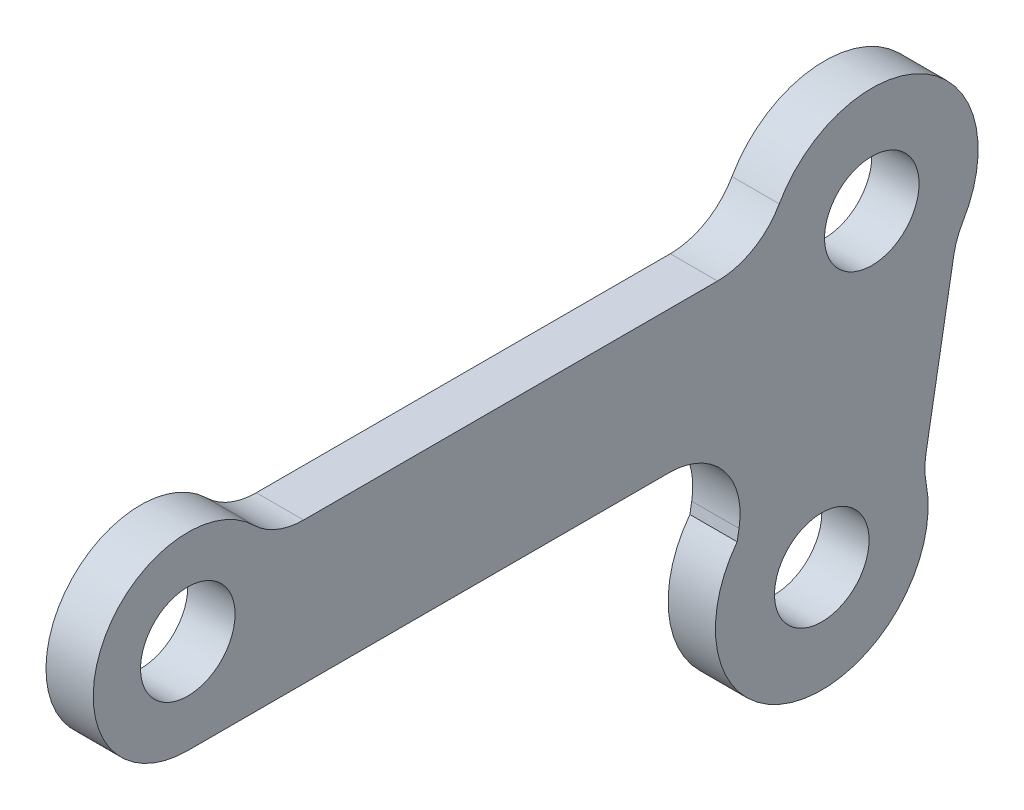
ISO-10303-21;
HEADER;
FILE_DESCRIPTION(('STEP AP214'),'2;1');
FILE_NAME('part.step','',(''),(''),'','','');
FILE_SCHEMA(('AUTOMOTIVE_DESIGN { 1 0 10303 214 1 1 1 1 }'));
ENDSEC;
DATA;
#1=APPLICATION_CONTEXT('core data for automotive mechanical design processes');
#2=APPLICATION_PROTOCOL_DEFINITION('international standard','automotive_design',2000,#1);
#3=PRODUCT_CONTEXT('',#1,'mechanical');
#4=PRODUCT('Part','Part','',(#3));
#5=PRODUCT_RELATED_PRODUCT_CATEGORY('part','',(#4));
#6=PRODUCT_DEFINITION_FORMATION('','',#4);
#7=PRODUCT_DEFINITION_CONTEXT('part definition',#1,'design');
#8=PRODUCT_DEFINITION('design','',#6,#7);
#9=PRODUCT_DEFINITION_SHAPE('','',#8);
#10=(LENGTH_UNIT() NAMED_UNIT(*) SI_UNIT(.MILLI.,.METRE.));
#11=(NAMED_UNIT(*) PLANE_ANGLE_UNIT() SI_UNIT($,.RADIAN.));
#12=(NAMED_UNIT(*) SI_UNIT($,.STERADIAN.) SOLID_ANGLE_UNIT());
#13=UNCERTAINTY_MEASURE_WITH_UNIT(LENGTH_MEASURE(1.E-05),#10,'distance_accuracy_value','');
#14=(GEOMETRIC_REPRESENTATION_CONTEXT(3) GLOBAL_UNCERTAINTY_ASSIGNED_CONTEXT((#13)) GLOBAL_UNIT_ASSIGNED_CONTEXT((#10,
#11,#12)) REPRESENTATION_CONTEXT('',''));
#15=CARTESIAN_POINT('',(0.,0.,0.));
#16=DIRECTION('',(0.,0.,1.));
#17=DIRECTION('',(1.,0.,0.));
#18=AXIS2_PLACEMENT_3D('',#15,#16,#17);
#19=CARTESIAN_POINT('',(0.,-2.,25.));
#20=DIRECTION('',(1.,0.,0.));
#21=DIRECTION('',(0.,0.,-1.));
#22=AXIS2_PLACEMENT_3D('',#19,#20,#21);
#23=PLANE('',#22);
#24=CARTESIAN_POINT('',(0.,-2.,25.));
#25=DIRECTION('',(1.,0.,0.));
#26=DIRECTION('',(0.,0.,-1.));
#27=AXIS2_PLACEMENT_3D('',#24,#25,#26);
#28=CIRCLE('',#27,2.);
#29=CARTESIAN_POINT('',(0.,-2.,23.));
#30=VERTEX_POINT('',#29);
#31=EDGE_CURVE('E438',#30,#30,#28,.T.);
#32=ORIENTED_EDGE('',*,*,#31,.T.);
#33=EDGE_LOOP('',(#32));
#34=FACE_BOUND('',#33,.T.);
#35=CARTESIAN_POINT('',(0.,-0.694592710667744,-3.93923101204885));
#36=DIRECTION('',(1.,0.,0.));
#37=DIRECTION('',(0.,0.,-1.));
#38=AXIS2_PLACEMENT_3D('',#35,#36,#37);
#39=CIRCLE('',#38,2.);
#40=CARTESIAN_POINT('',(0.,-0.694592710667744,-5.93923101204885));
#41=VERTEX_POINT('',#40);
#42=EDGE_CURVE('E434',#41,#41,#39,.T.);
#43=ORIENTED_EDGE('',*,*,#42,.T.);
#44=EDGE_LOOP('',(#43));
#45=FACE_BOUND('',#44,.T.);
#46=CARTESIAN_POINT('',(0.,-12.6945927106677,-1.82330724354715));
#47=DIRECTION('',(1.,0.,0.));
#48=DIRECTION('',(0.,0.,-1.));
#49=AXIS2_PLACEMENT_3D('',#46,#47,#48);
#50=CIRCLE('',#49,2.);
#51=CARTESIAN_POINT('',(0.,-12.6945927106677,-3.82330724354715));
#52=VERTEX_POINT('',#51);
#53=EDGE_CURVE('E426',#52,#52,#50,.T.);
#54=ORIENTED_EDGE('',*,*,#53,.T.);
#55=EDGE_LOOP('',(#54));
#56=FACE_BOUND('',#55,.T.);
#57=CARTESIAN_POINT('',(0.,-0.694592710667744,-3.93923101204885));
#58=DIRECTION('',(1.,0.,0.));
#59=DIRECTION('',(0.,0.,-1.));
#60=AXIS2_PLACEMENT_3D('',#57,#58,#59);
#61=CIRCLE('',#60,4.50000000000002);
#62=CARTESIAN_POINT('',(0.,-3.01492067286327,-7.79488635814162));
#63=VERTEX_POINT('',#62);
#64=CARTESIAN_POINT('',(0.,1.52216291573291,-0.0231111858916789));
#65=VERTEX_POINT('',#64);
#66=EDGE_CURVE('E246',#63,#65,#61,.T.);
#67=ORIENTED_EDGE('',*,*,#66,.F.);
#68=CARTESIAN_POINT('',(0.,-4.56180598099362,-10.3653232555368));
#69=DIRECTION('',(1.,0.,0.));
#70=DIRECTION('',(0.,0.,-1.));
#71=AXIS2_PLACEMENT_3D('',#68,#69,#70);
#72=CIRCLE('',#71,3.);
#73=CARTESIAN_POINT('',(0.,-4.0408614479928,-7.41089999650016));
#74=VERTEX_POINT('',#73);
#75=EDGE_CURVE('E319',#63,#74,#72,.T.);
#76=ORIENTED_EDGE('',*,*,#75,.T.);
#77=DIRECTION('',(0.,-0.984807753012206,0.173648177666942));
#78=VECTOR('',#77,1.);
#79=CARTESIAN_POINT('',(0.,-1.38918542133549,-7.8784620240977));
#80=LINE('',#79,#78);
#81=CARTESIAN_POINT('',(0.,-10.7375093946782,-6.23010028319352));
#82=VERTEX_POINT('',#81);
#83=EDGE_CURVE('E259',#74,#82,#80,.T.);
#84=ORIENTED_EDGE('',*,*,#83,.T.);
#85=CARTESIAN_POINT('',(0.,-11.258453927679,-9.18452354223013));
#86=DIRECTION('',(1.,0.,0.));
#87=DIRECTION('',(0.,0.,-1.));
#88=AXIS2_PLACEMENT_3D('',#85,#86,#87);
#89=CIRCLE('',#88,3.);
#90=CARTESIAN_POINT('',(0.,-11.8329094408745,-6.24003702275695));
#91=VERTEX_POINT('',#90);
#92=EDGE_CURVE('E313',#82,#91,#89,.T.);
#93=ORIENTED_EDGE('',*,*,#92,.T.);
#94=CARTESIAN_POINT('',(0.,-12.6945927106677,-1.82330724354715));
#95=DIRECTION('',(1.,0.,0.));
#96=DIRECTION('',(0.,0.,-1.));
#97=AXIS2_PLACEMENT_3D('',#94,#95,#96);
#98=CIRCLE('',#97,4.50000000000002);
#99=CARTESIAN_POINT('',(0.,-9.96976680670167,1.75793887939326));
#100=VERTEX_POINT('',#99);
#101=EDGE_CURVE('E273',#100,#91,#98,.T.);
#102=ORIENTED_EDGE('',*,*,#101,.F.);
#103=DIRECTION('',(0.,-0.984807753012207,0.173648177666938));
#104=VECTOR('',#103,1.);
#105=CARTESIAN_POINT('',(0.,0.,0.));
#106=LINE('',#105,#104);
#107=CARTESIAN_POINT('',(0.,-9.52094453300082,1.67879940299688));
#108=VERTEX_POINT('',#107);
#109=EDGE_CURVE('E263',#108,#100,#106,.T.);
#110=ORIENTED_EDGE('',*,*,#109,.F.);
#111=CARTESIAN_POINT('',(0.,-9.00000000000001,4.6332226620335));
#112=DIRECTION('',(1.,0.,0.));
#113=DIRECTION('',(0.,0.,-1.));
#114=AXIS2_PLACEMENT_3D('',#111,#112,#113);
#115=CIRCLE('',#114,3.);
#116=CARTESIAN_POINT('',(0.,-6.,4.6332226620335));
#117=VERTEX_POINT('',#116);
#118=EDGE_CURVE('E236',#108,#117,#115,.T.);
#119=ORIENTED_EDGE('',*,*,#118,.T.);
#120=DIRECTION('',(0.,0.,-1.));
#121=VECTOR('',#120,1.);
#122=CARTESIAN_POINT('',(0.,-6.,25.));
#123=LINE('',#122,#121);
#124=CARTESIAN_POINT('',(0.,-5.99999999999999,25.));
#125=VERTEX_POINT('',#124);
#126=EDGE_CURVE('E227',#125,#117,#123,.T.);
#127=ORIENTED_EDGE('',*,*,#126,.F.);
#128=CARTESIAN_POINT('',(0.,-2.,25.));
#129=DIRECTION('',(1.,0.,0.));
#130=DIRECTION('',(0.,0.,-1.));
#131=AXIS2_PLACEMENT_3D('',#128,#129,#130);
#132=CIRCLE('',#131,3.99999999999999);
#133=CARTESIAN_POINT('',(0.,0.857142857142855,22.200583151105));
#134=VERTEX_POINT('',#133);
#135=EDGE_CURVE('E212',#134,#125,#132,.T.);
#136=ORIENTED_EDGE('',*,*,#135,.F.);
#137=CARTESIAN_POINT('',(0.,3.,20.1010205144337));
#138=DIRECTION('',(1.,0.,0.));
#139=DIRECTION('',(0.,0.,-1.));
#140=AXIS2_PLACEMENT_3D('',#137,#138,#139);
#141=CIRCLE('',#140,3.);
#142=CARTESIAN_POINT('',(0.,0.,20.1010205144337));
#143=VERTEX_POINT('',#142);
#144=EDGE_CURVE('E132',#134,#143,#141,.T.);
#145=ORIENTED_EDGE('',*,*,#144,.T.);
#146=DIRECTION('',(0.,0.,-1.));
#147=VECTOR('',#146,1.);
#148=CARTESIAN_POINT('',(0.,0.,25.));
#149=LINE('',#148,#147);
#150=CARTESIAN_POINT('',(0.,0.,2.58763536487976));
#151=VERTEX_POINT('',#150);
#152=EDGE_CURVE('E238',#143,#151,#149,.T.);
#153=ORIENTED_EDGE('',*,*,#152,.T.);
#154=CARTESIAN_POINT('',(0.,3.,2.58763536487975));
#155=DIRECTION('',(1.,0.,0.));
#156=DIRECTION('',(0.,0.,-1.));
#157=AXIS2_PLACEMENT_3D('',#154,#155,#156);
#158=CIRCLE('',#157,3.);
#159=EDGE_CURVE('E330',#151,#65,#158,.T.);
#160=ORIENTED_EDGE('',*,*,#159,.T.);
#161=EDGE_LOOP('',(#67,#76,#84,#93,#102,#110,#119,#127,#136,#145,#153,#160));
#162=FACE_BOUND('',#161,.T.);
#163=ADVANCED_FACE('F123',(#34,#45,#56,#162),#23,.F.);
#164=CARTESIAN_POINT('',(2.,-2.,25.));
#165=DIRECTION('',(1.,0.,0.));
#166=DIRECTION('',(0.,0.,-1.));
#167=AXIS2_PLACEMENT_3D('',#164,#165,#166);
#168=PLANE('',#167);
#169=CARTESIAN_POINT('',(2.,-2.,25.));
#170=DIRECTION('',(1.,0.,0.));
#171=DIRECTION('',(0.,0.,-1.));
#172=AXIS2_PLACEMENT_3D('',#169,#170,#171);
#173=CIRCLE('',#172,2.);
#174=CARTESIAN_POINT('',(2.,-2.,23.));
#175=VERTEX_POINT('',#174);
#176=EDGE_CURVE('E277',#175,#175,#173,.T.);
#177=ORIENTED_EDGE('',*,*,#176,.F.);
#178=EDGE_LOOP('',(#177));
#179=FACE_BOUND('',#178,.T.);
#180=CARTESIAN_POINT('',(2.,-0.694592710667744,-3.93923101204885));
#181=DIRECTION('',(1.,0.,0.));
#182=DIRECTION('',(0.,0.,-1.));
#183=AXIS2_PLACEMENT_3D('',#180,#181,#182);
#184=CIRCLE('',#183,2.);
#185=CARTESIAN_POINT('',(2.,-0.694592710667744,-5.93923101204885));
#186=VERTEX_POINT('',#185);
#187=EDGE_CURVE('E430',#186,#186,#184,.T.);
#188=ORIENTED_EDGE('',*,*,#187,.F.);
#189=EDGE_LOOP('',(#188));
#190=FACE_BOUND('',#189,.T.);
#191=CARTESIAN_POINT('',(2.,-12.6945927106677,-1.82330724354715));
#192=DIRECTION('',(1.,0.,0.));
#193=DIRECTION('',(0.,0.,-1.));
#194=AXIS2_PLACEMENT_3D('',#191,#192,#193);
#195=CIRCLE('',#194,2.);
#196=CARTESIAN_POINT('',(2.,-12.6945927106677,-3.82330724354715));
#197=VERTEX_POINT('',#196);
#198=EDGE_CURVE('E422',#197,#197,#195,.T.);
#199=ORIENTED_EDGE('',*,*,#198,.F.);
#200=EDGE_LOOP('',(#199));
#201=FACE_BOUND('',#200,.T.);
#202=DIRECTION('',(0.,-0.984807753012206,0.173648177666942));
#203=VECTOR('',#202,1.);
#204=CARTESIAN_POINT('',(2.,-1.38918542133549,-7.8784620240977));
#205=LINE('',#204,#203);
#206=CARTESIAN_POINT('',(2.,-4.0408614479928,-7.41089999650016));
#207=VERTEX_POINT('',#206);
#208=CARTESIAN_POINT('',(2.,-10.7375093946782,-6.23010028319352));
#209=VERTEX_POINT('',#208);
#210=EDGE_CURVE('E258',#207,#209,#205,.T.);
#211=ORIENTED_EDGE('',*,*,#210,.F.);
#212=CARTESIAN_POINT('',(2.,-4.56180598099362,-10.3653232555368));
#213=DIRECTION('',(1.,0.,0.));
#214=DIRECTION('',(0.,0.,-1.));
#215=AXIS2_PLACEMENT_3D('',#212,#213,#214);
#216=CIRCLE('',#215,3.);
#217=CARTESIAN_POINT('',(2.,-3.01492067286327,-7.79488635814162));
#218=VERTEX_POINT('',#217);
#219=EDGE_CURVE('E322',#207,#218,#216,.F.);
#220=ORIENTED_EDGE('',*,*,#219,.T.);
#221=CARTESIAN_POINT('',(2.,-0.694592710667744,-3.93923101204885));
#222=DIRECTION('',(1.,0.,0.));
#223=DIRECTION('',(0.,0.,-1.));
#224=AXIS2_PLACEMENT_3D('',#221,#222,#223);
#225=CIRCLE('',#224,4.50000000000002);
#226=CARTESIAN_POINT('',(2.,1.52216291573291,-0.0231111858916789));
#227=VERTEX_POINT('',#226);
#228=EDGE_CURVE('E239',#218,#227,#225,.T.);
#229=ORIENTED_EDGE('',*,*,#228,.T.);
#230=CARTESIAN_POINT('',(2.,3.,2.58763536487975));
#231=DIRECTION('',(1.,0.,0.));
#232=DIRECTION('',(0.,0.,-1.));
#233=AXIS2_PLACEMENT_3D('',#230,#231,#232);
#234=CIRCLE('',#233,3.);
#235=CARTESIAN_POINT('',(2.,0.,2.58763536487976));
#236=VERTEX_POINT('',#235);
#237=EDGE_CURVE('E333',#227,#236,#234,.F.);
#238=ORIENTED_EDGE('',*,*,#237,.T.);
#239=DIRECTION('',(0.,0.,-1.));
#240=VECTOR('',#239,1.);
#241=CARTESIAN_POINT('',(2.,0.,25.));
#242=LINE('',#241,#240);
#243=CARTESIAN_POINT('',(2.,0.,20.1010205144337));
#244=VERTEX_POINT('',#243);
#245=EDGE_CURVE('E222',#244,#236,#242,.T.);
#246=ORIENTED_EDGE('',*,*,#245,.F.);
#247=CARTESIAN_POINT('',(2.,3.,20.1010205144337));
#248=DIRECTION('',(1.,0.,0.));
#249=DIRECTION('',(0.,0.,-1.));
#250=AXIS2_PLACEMENT_3D('',#247,#248,#249);
#251=CIRCLE('',#250,3.);
#252=CARTESIAN_POINT('',(2.,0.857142857142855,22.200583151105));
#253=VERTEX_POINT('',#252);
#254=EDGE_CURVE('E12',#244,#253,#251,.F.);
#255=ORIENTED_EDGE('',*,*,#254,.T.);
#256=CARTESIAN_POINT('',(2.,-2.,25.));
#257=DIRECTION('',(1.,0.,0.));
#258=DIRECTION('',(0.,0.,-1.));
#259=AXIS2_PLACEMENT_3D('',#256,#257,#258);
#260=CIRCLE('',#259,3.99999999999999);
#261=CARTESIAN_POINT('',(2.,-6.,25.));
#262=VERTEX_POINT('',#261);
#263=EDGE_CURVE('E221',#253,#262,#260,.T.);
#264=ORIENTED_EDGE('',*,*,#263,.T.);
#265=DIRECTION('',(0.,0.,-1.));
#266=VECTOR('',#265,1.);
#267=CARTESIAN_POINT('',(2.,-6.,25.));
#268=LINE('',#267,#266);
#269=CARTESIAN_POINT('',(2.,-6.,4.6332226620335));
#270=VERTEX_POINT('',#269);
#271=EDGE_CURVE('E230',#262,#270,#268,.T.);
#272=ORIENTED_EDGE('',*,*,#271,.T.);
#273=CARTESIAN_POINT('',(2.,-9.00000000000001,4.6332226620335));
#274=DIRECTION('',(1.,0.,0.));
#275=DIRECTION('',(0.,0.,-1.));
#276=AXIS2_PLACEMENT_3D('',#273,#274,#275);
#277=CIRCLE('',#276,3.);
#278=CARTESIAN_POINT('',(2.,-9.52094453300082,1.67879940299688));
#279=VERTEX_POINT('',#278);
#280=EDGE_CURVE('E327',#270,#279,#277,.F.);
#281=ORIENTED_EDGE('',*,*,#280,.T.);
#282=DIRECTION('',(0.,-0.984807753012207,0.173648177666938));
#283=VECTOR('',#282,1.);
#284=CARTESIAN_POINT('',(2.,0.,0.));
#285=LINE('',#284,#283);
#286=CARTESIAN_POINT('',(2.,-9.96976680670167,1.75793887939326));
#287=VERTEX_POINT('',#286);
#288=EDGE_CURVE('E255',#279,#287,#285,.T.);
#289=ORIENTED_EDGE('',*,*,#288,.T.);
#290=CARTESIAN_POINT('',(2.,-12.6945927106677,-1.82330724354715));
#291=DIRECTION('',(1.,0.,0.));
#292=DIRECTION('',(0.,0.,-1.));
#293=AXIS2_PLACEMENT_3D('',#290,#291,#292);
#294=CIRCLE('',#293,4.50000000000002);
#295=CARTESIAN_POINT('',(2.,-11.8329094408745,-6.24003702275695));
#296=VERTEX_POINT('',#295);
#297=EDGE_CURVE('E266',#287,#296,#294,.T.);
#298=ORIENTED_EDGE('',*,*,#297,.T.);
#299=CARTESIAN_POINT('',(2.,-11.258453927679,-9.18452354223013));
#300=DIRECTION('',(1.,0.,0.));
#301=DIRECTION('',(0.,0.,-1.));
#302=AXIS2_PLACEMENT_3D('',#299,#300,#301);
#303=CIRCLE('',#302,3.);
#304=EDGE_CURVE('E316',#296,#209,#303,.F.);
#305=ORIENTED_EDGE('',*,*,#304,.T.);
#306=EDGE_LOOP('',(#211,#220,#229,#238,#246,#255,#264,#272,#281,#289,#298,#305));
#307=FACE_BOUND('',#306,.T.);
#308=ADVANCED_FACE('F350',(#179,#190,#201,#307),#168,.T.);
#309=CARTESIAN_POINT('',(2.,-2.,25.));
#310=DIRECTION('',(-1.,0.,0.));
#311=DIRECTION('',(0.,0.,1.));
#312=AXIS2_PLACEMENT_3D('',#309,#310,#311);
#313=CYLINDRICAL_SURFACE('',#312,3.99999999999999);
#314=ORIENTED_EDGE('',*,*,#263,.F.);
#315=DIRECTION('',(-1.,0.,0.));
#316=VECTOR('',#315,1.);
#317=CARTESIAN_POINT('',(2.,0.857142857142856,22.200583151105));
#318=LINE('',#317,#316);
#319=EDGE_CURVE('E217',#253,#134,#318,.T.);
#320=ORIENTED_EDGE('',*,*,#319,.T.);
#321=ORIENTED_EDGE('',*,*,#135,.T.);
#322=DIRECTION('',(-1.,0.,0.));
#323=VECTOR('',#322,1.);
#324=CARTESIAN_POINT('',(2.,-6.,25.));
#325=LINE('',#324,#323);
#326=EDGE_CURVE('E215',#262,#125,#325,.T.);
#327=ORIENTED_EDGE('',*,*,#326,.F.);
#328=EDGE_LOOP('',(#314,#320,#321,#327));
#329=FACE_BOUND('',#328,.T.);
#330=ADVANCED_FACE('F214',(#329),#313,.T.);
#331=CARTESIAN_POINT('',(2.,-12.6945927106677,-1.82330724354715));
#332=DIRECTION('',(-1.,0.,0.));
#333=DIRECTION('',(0.,0.,1.));
#334=AXIS2_PLACEMENT_3D('',#331,#332,#333);
#335=CYLINDRICAL_SURFACE('',#334,4.50000000000002);
#336=ORIENTED_EDGE('',*,*,#101,.T.);
#337=DIRECTION('',(-1.,0.,0.));
#338=VECTOR('',#337,1.);
#339=CARTESIAN_POINT('',(2.,-11.8329094408745,-6.24003702275695));
#340=LINE('',#339,#338);
#341=EDGE_CURVE('E287',#91,#296,#340,.F.);
#342=ORIENTED_EDGE('',*,*,#341,.T.);
#343=ORIENTED_EDGE('',*,*,#297,.F.);
#344=DIRECTION('',(-1.,0.,0.));
#345=VECTOR('',#344,1.);
#346=CARTESIAN_POINT('',(2.,-9.96976680670167,1.75793887939326));
#347=LINE('',#346,#345);
#348=EDGE_CURVE('E254',#287,#100,#347,.T.);
#349=ORIENTED_EDGE('',*,*,#348,.T.);
#350=EDGE_LOOP('',(#336,#342,#343,#349));
#351=FACE_BOUND('',#350,.T.);
#352=ADVANCED_FACE('F349',(#351),#335,.T.);
#353=CARTESIAN_POINT('',(2.,-1.38918542133549,-7.8784620240977));
#354=DIRECTION('',(0.,-0.173648177666942,-0.984807753012206));
#355=DIRECTION('',(0.,0.984807753012206,-0.173648177666942));
#356=AXIS2_PLACEMENT_3D('',#353,#354,#355);
#357=PLANE('',#356);
#358=ORIENTED_EDGE('',*,*,#210,.T.);
#359=DIRECTION('',(-1.,0.,0.));
#360=VECTOR('',#359,1.);
#361=CARTESIAN_POINT('',(2.,-10.7375093946782,-6.23010028319352));
#362=LINE('',#361,#360);
#363=EDGE_CURVE('E283',#209,#82,#362,.T.);
#364=ORIENTED_EDGE('',*,*,#363,.T.);
#365=ORIENTED_EDGE('',*,*,#83,.F.);
#366=DIRECTION('',(-1.,0.,0.));
#367=VECTOR('',#366,1.);
#368=CARTESIAN_POINT('',(2.,-4.0408614479928,-7.41089999650016));
#369=LINE('',#368,#367);
#370=EDGE_CURVE('E232',#74,#207,#369,.F.);
#371=ORIENTED_EDGE('',*,*,#370,.T.);
#372=EDGE_LOOP('',(#358,#364,#365,#371));
#373=FACE_BOUND('',#372,.T.);
#374=ADVANCED_FACE('F356',(#373),#357,.T.);
#375=CARTESIAN_POINT('',(2.,0.,0.));
#376=DIRECTION('',(0.,-0.173648177666938,-0.984807753012207));
#377=DIRECTION('',(0.,0.984807753012207,-0.173648177666938));
#378=AXIS2_PLACEMENT_3D('',#375,#376,#377);
#379=PLANE('',#378);
#380=ORIENTED_EDGE('',*,*,#288,.F.);
#381=DIRECTION('',(-1.,0.,0.));
#382=VECTOR('',#381,1.);
#383=CARTESIAN_POINT('',(0.,-9.52094453300082,1.67879940299688));
#384=LINE('',#383,#382);
#385=EDGE_CURVE('E297',#279,#108,#384,.T.);
#386=ORIENTED_EDGE('',*,*,#385,.T.);
#387=ORIENTED_EDGE('',*,*,#109,.T.);
#388=ORIENTED_EDGE('',*,*,#348,.F.);
#389=EDGE_LOOP('',(#380,#386,#387,#388));
#390=FACE_BOUND('',#389,.T.);
#391=ADVANCED_FACE('F359',(#390),#379,.F.);
#392=CARTESIAN_POINT('',(2.,-0.694592710667744,-3.93923101204885));
#393=DIRECTION('',(-1.,0.,0.));
#394=DIRECTION('',(0.,0.,1.));
#395=AXIS2_PLACEMENT_3D('',#392,#393,#394);
#396=CYLINDRICAL_SURFACE('',#395,4.50000000000002);
#397=ORIENTED_EDGE('',*,*,#228,.F.);
#398=DIRECTION('',(-1.,0.,0.));
#399=VECTOR('',#398,1.);
#400=CARTESIAN_POINT('',(2.,-3.01492067286327,-7.79488635814162));
#401=LINE('',#400,#399);
#402=EDGE_CURVE('E293',#218,#63,#401,.T.);
#403=ORIENTED_EDGE('',*,*,#402,.T.);
#404=ORIENTED_EDGE('',*,*,#66,.T.);
#405=DIRECTION('',(-1.,0.,0.));
#406=VECTOR('',#405,1.);
#407=CARTESIAN_POINT('',(2.,1.52216291573291,-0.0231111858916789));
#408=LINE('',#407,#406);
#409=EDGE_CURVE('E290',#65,#227,#408,.F.);
#410=ORIENTED_EDGE('',*,*,#409,.T.);
#411=EDGE_LOOP('',(#397,#403,#404,#410));
#412=FACE_BOUND('',#411,.T.);
#413=ADVANCED_FACE('F363',(#412),#396,.T.);
#414=CARTESIAN_POINT('',(2.,0.,25.));
#415=DIRECTION('',(0.,1.,0.));
#416=DIRECTION('',(0.,0.,1.));
#417=AXIS2_PLACEMENT_3D('',#414,#415,#416);
#418=PLANE('',#417);
#419=ORIENTED_EDGE('',*,*,#245,.T.);
#420=DIRECTION('',(-1.,0.,0.));
#421=VECTOR('',#420,1.);
#422=CARTESIAN_POINT('',(2.,0.,2.58763536487976));
#423=LINE('',#422,#421);
#424=EDGE_CURVE('E307',#236,#151,#423,.T.);
#425=ORIENTED_EDGE('',*,*,#424,.T.);
#426=ORIENTED_EDGE('',*,*,#152,.F.);
#427=DIRECTION('',(-1.,0.,0.));
#428=VECTOR('',#427,1.);
#429=CARTESIAN_POINT('',(2.,0.,20.1010205144337));
#430=LINE('',#429,#428);
#431=EDGE_CURVE('E304',#143,#244,#430,.F.);
#432=ORIENTED_EDGE('',*,*,#431,.T.);
#433=EDGE_LOOP('',(#419,#425,#426,#432));
#434=FACE_BOUND('',#433,.T.);
#435=ADVANCED_FACE('F339',(#434),#418,.T.);
#436=CARTESIAN_POINT('',(2.,-6.,25.));
#437=DIRECTION('',(0.,1.,0.));
#438=DIRECTION('',(0.,0.,1.));
#439=AXIS2_PLACEMENT_3D('',#436,#437,#438);
#440=PLANE('',#439);
#441=ORIENTED_EDGE('',*,*,#126,.T.);
#442=DIRECTION('',(-1.,0.,0.));
#443=VECTOR('',#442,1.);
#444=CARTESIAN_POINT('',(2.,-6.,4.6332226620335));
#445=LINE('',#444,#443);
#446=EDGE_CURVE('E301',#117,#270,#445,.F.);
#447=ORIENTED_EDGE('',*,*,#446,.T.);
#448=ORIENTED_EDGE('',*,*,#271,.F.);
#449=ORIENTED_EDGE('',*,*,#326,.T.);
#450=EDGE_LOOP('',(#441,#447,#448,#449));
#451=FACE_BOUND('',#450,.T.);
#452=ADVANCED_FACE('F226',(#451),#440,.F.);
#453=CARTESIAN_POINT('',(2.,-12.6945927106677,-1.82330724354715));
#454=DIRECTION('',(-1.,0.,0.));
#455=DIRECTION('',(0.,0.,1.));
#456=AXIS2_PLACEMENT_3D('',#453,#454,#455);
#457=CYLINDRICAL_SURFACE('',#456,2.);
#458=ORIENTED_EDGE('',*,*,#198,.T.);
#459=EDGE_LOOP('',(#458));
#460=FACE_BOUND('',#459,.T.);
#461=ORIENTED_EDGE('',*,*,#53,.F.);
#462=EDGE_LOOP('',(#461));
#463=FACE_BOUND('',#462,.T.);
#464=ADVANCED_FACE('F362',(#460,#463),#457,.F.);
#465=CARTESIAN_POINT('',(2.,-0.694592710667744,-3.93923101204885));
#466=DIRECTION('',(-1.,0.,0.));
#467=DIRECTION('',(0.,0.,1.));
#468=AXIS2_PLACEMENT_3D('',#465,#466,#467);
#469=CYLINDRICAL_SURFACE('',#468,2.);
#470=ORIENTED_EDGE('',*,*,#187,.T.);
#471=EDGE_LOOP('',(#470));
#472=FACE_BOUND('',#471,.T.);
#473=ORIENTED_EDGE('',*,*,#42,.F.);
#474=EDGE_LOOP('',(#473));
#475=FACE_BOUND('',#474,.T.);
#476=ADVANCED_FACE('F453',(#472,#475),#469,.F.);
#477=CARTESIAN_POINT('',(2.,-2.,25.));
#478=DIRECTION('',(-1.,0.,0.));
#479=DIRECTION('',(0.,0.,1.));
#480=AXIS2_PLACEMENT_3D('',#477,#478,#479);
#481=CYLINDRICAL_SURFACE('',#480,2.);
#482=ORIENTED_EDGE('',*,*,#176,.T.);
#483=EDGE_LOOP('',(#482));
#484=FACE_BOUND('',#483,.T.);
#485=ORIENTED_EDGE('',*,*,#31,.F.);
#486=EDGE_LOOP('',(#485));
#487=FACE_BOUND('',#486,.T.);
#488=ADVANCED_FACE('F391',(#484,#487),#481,.F.);
#489=CARTESIAN_POINT('',(2.,-11.258453927679,-9.18452354223013));
#490=DIRECTION('',(-1.,0.,0.));
#491=DIRECTION('',(0.,0.,1.));
#492=AXIS2_PLACEMENT_3D('',#489,#490,#491);
#493=CYLINDRICAL_SURFACE('',#492,3.);
#494=ORIENTED_EDGE('',*,*,#304,.F.);
#495=ORIENTED_EDGE('',*,*,#341,.F.);
#496=ORIENTED_EDGE('',*,*,#92,.F.);
#497=ORIENTED_EDGE('',*,*,#363,.F.);
#498=EDGE_LOOP('',(#494,#495,#496,#497));
#499=FACE_BOUND('',#498,.T.);
#500=ADVANCED_FACE('F387',(#499),#493,.F.);
#501=CARTESIAN_POINT('',(2.,-4.56180598099362,-10.3653232555368));
#502=DIRECTION('',(-1.,0.,0.));
#503=DIRECTION('',(0.,0.,1.));
#504=AXIS2_PLACEMENT_3D('',#501,#502,#503);
#505=CYLINDRICAL_SURFACE('',#504,3.);
#506=ORIENTED_EDGE('',*,*,#219,.F.);
#507=ORIENTED_EDGE('',*,*,#370,.F.);
#508=ORIENTED_EDGE('',*,*,#75,.F.);
#509=ORIENTED_EDGE('',*,*,#402,.F.);
#510=EDGE_LOOP('',(#506,#507,#508,#509));
#511=FACE_BOUND('',#510,.T.);
#512=ADVANCED_FACE('F390',(#511),#505,.F.);
#513=CARTESIAN_POINT('',(2.,-9.00000000000001,4.6332226620335));
#514=DIRECTION('',(1.,0.,0.));
#515=DIRECTION('',(0.,0.,-1.));
#516=AXIS2_PLACEMENT_3D('',#513,#514,#515);
#517=CYLINDRICAL_SURFACE('',#516,3.);
#518=ORIENTED_EDGE('',*,*,#280,.F.);
#519=ORIENTED_EDGE('',*,*,#446,.F.);
#520=ORIENTED_EDGE('',*,*,#118,.F.);
#521=ORIENTED_EDGE('',*,*,#385,.F.);
#522=EDGE_LOOP('',(#518,#519,#520,#521));
#523=FACE_BOUND('',#522,.T.);
#524=ADVANCED_FACE('F346',(#523),#517,.F.);
#525=CARTESIAN_POINT('',(2.,3.,2.58763536487975));
#526=DIRECTION('',(-1.,0.,0.));
#527=DIRECTION('',(0.,0.,1.));
#528=AXIS2_PLACEMENT_3D('',#525,#526,#527);
#529=CYLINDRICAL_SURFACE('',#528,3.);
#530=ORIENTED_EDGE('',*,*,#237,.F.);
#531=ORIENTED_EDGE('',*,*,#409,.F.);
#532=ORIENTED_EDGE('',*,*,#159,.F.);
#533=ORIENTED_EDGE('',*,*,#424,.F.);
#534=EDGE_LOOP('',(#530,#531,#532,#533));
#535=FACE_BOUND('',#534,.T.);
#536=ADVANCED_FACE('F342',(#535),#529,.F.);
#537=CARTESIAN_POINT('',(2.,3.,20.1010205144337));
#538=DIRECTION('',(-1.,0.,0.));
#539=DIRECTION('',(0.,0.,1.));
#540=AXIS2_PLACEMENT_3D('',#537,#538,#539);
#541=CYLINDRICAL_SURFACE('',#540,3.);
#542=ORIENTED_EDGE('',*,*,#254,.F.);
#543=ORIENTED_EDGE('',*,*,#431,.F.);
#544=ORIENTED_EDGE('',*,*,#144,.F.);
#545=ORIENTED_EDGE('',*,*,#319,.F.);
#546=EDGE_LOOP('',(#542,#543,#544,#545));
#547=FACE_BOUND('',#546,.T.);
#548=ADVANCED_FACE('F125',(#547),#541,.F.);
#549=CLOSED_SHELL('',(#163,#308,#330,#352,#374,#391,#413,#435,#452,#464,#476,#488,#500,#512,
#524,#536,#548));
#550=MANIFOLD_SOLID_BREP('B2',#549);
#551=ADVANCED_BREP_SHAPE_REPRESENTATION('',(#18,#550),#14);
#552=SHAPE_DEFINITION_REPRESENTATION(#9,#551);
ENDSEC;
END-ISO-10303-21;
